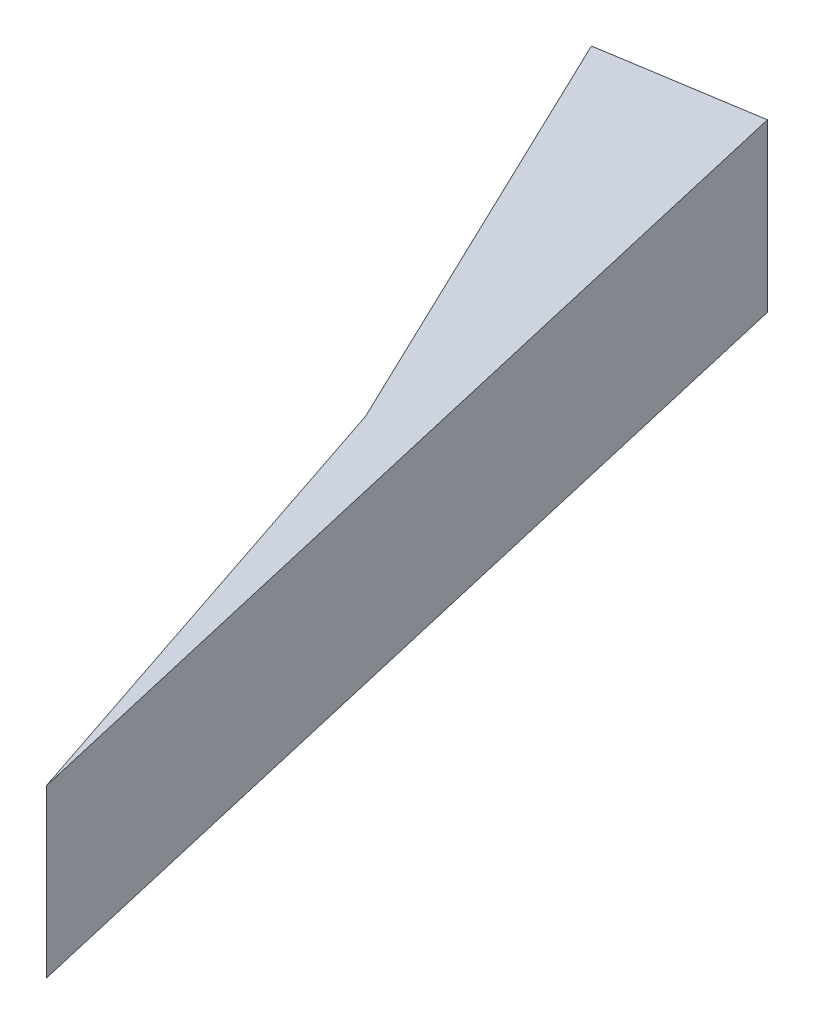
ISO-10303-21;
HEADER;
FILE_DESCRIPTION(('STEP AP214'),'2;1');
FILE_NAME('part.step','',(''),(''),'','','');
FILE_SCHEMA(('AUTOMOTIVE_DESIGN { 1 0 10303 214 1 1 1 1 }'));
ENDSEC;
DATA;
#1=APPLICATION_CONTEXT('core data for automotive mechanical design processes');
#2=APPLICATION_PROTOCOL_DEFINITION('international standard','automotive_design',2000,#1);
#3=PRODUCT_CONTEXT('',#1,'mechanical');
#4=PRODUCT('Part','Part','',(#3));
#5=PRODUCT_RELATED_PRODUCT_CATEGORY('part','',(#4));
#6=PRODUCT_DEFINITION_FORMATION('','',#4);
#7=PRODUCT_DEFINITION_CONTEXT('part definition',#1,'design');
#8=PRODUCT_DEFINITION('design','',#6,#7);
#9=PRODUCT_DEFINITION_SHAPE('','',#8);
#10=(LENGTH_UNIT() NAMED_UNIT(*) SI_UNIT(.MILLI.,.METRE.));
#11=(NAMED_UNIT(*) PLANE_ANGLE_UNIT() SI_UNIT($,.RADIAN.));
#12=(NAMED_UNIT(*) SI_UNIT($,.STERADIAN.) SOLID_ANGLE_UNIT());
#13=UNCERTAINTY_MEASURE_WITH_UNIT(LENGTH_MEASURE(1.E-05),#10,'distance_accuracy_value','');
#14=(GEOMETRIC_REPRESENTATION_CONTEXT(3) GLOBAL_UNCERTAINTY_ASSIGNED_CONTEXT((#13)) GLOBAL_UNIT_ASSIGNED_CONTEXT((#10,
#11,#12)) REPRESENTATION_CONTEXT('',''));
#15=CARTESIAN_POINT('',(0.,0.,0.));
#16=DIRECTION('',(0.,0.,1.));
#17=DIRECTION('',(1.,0.,0.));
#18=AXIS2_PLACEMENT_3D('',#15,#16,#17);
#19=CARTESIAN_POINT('',(-19.402009430635,13.,9.29638780071025));
#20=DIRECTION('',(-0.901823425784166,0.,0.432104742749846));
#21=DIRECTION('',(0.432104742749846,0.,0.901823425784166));
#22=AXIS2_PLACEMENT_3D('',#19,#20,#21);
#23=PLANE('',#22);
#24=DIRECTION('',(-0.432104742749846,0.,-0.901823425784166));
#25=VECTOR('',#24,1.);
#26=CARTESIAN_POINT('',(-19.402009430635,-13.,9.29638780071025));
#27=LINE('',#26,#25);
#28=CARTESIAN_POINT('',(-8.10196130508189,-13.,32.8801329067246));
#29=VERTEX_POINT('',#28);
#30=CARTESIAN_POINT('',(-40.5098170113203,-13.,-34.7566240270878));
#31=VERTEX_POINT('',#30);
#32=EDGE_CURVE('E98',#29,#31,#27,.T.);
#33=ORIENTED_EDGE('',*,*,#32,.F.);
#34=DIRECTION('',(0.,-1.,0.));
#35=VECTOR('',#34,1.);
#36=CARTESIAN_POINT('',(-8.10196130508189,13.,32.8801329067246));
#37=LINE('',#36,#35);
#38=CARTESIAN_POINT('',(-8.10196130508189,13.,32.8801329067246));
#39=VERTEX_POINT('',#38);
#40=EDGE_CURVE('E11',#39,#29,#37,.T.);
#41=ORIENTED_EDGE('',*,*,#40,.F.);
#42=DIRECTION('',(-0.432104742749846,0.,-0.901823425784166));
#43=VECTOR('',#42,1.);
#44=CARTESIAN_POINT('',(-19.402009430635,13.,9.29638780071025));
#45=LINE('',#44,#43);
#46=CARTESIAN_POINT('',(-40.5098170113203,13.,-34.7566240270878));
#47=VERTEX_POINT('',#46);
#48=EDGE_CURVE('E83',#39,#47,#45,.T.);
#49=ORIENTED_EDGE('',*,*,#48,.T.);
#50=DIRECTION('',(0.,-1.,0.));
#51=VECTOR('',#50,1.);
#52=CARTESIAN_POINT('',(-40.5098170113203,13.,-34.7566240270878));
#53=LINE('',#52,#51);
#54=EDGE_CURVE('E51',#47,#31,#53,.T.);
#55=ORIENTED_EDGE('',*,*,#54,.T.);
#56=EDGE_LOOP('',(#33,#41,#49,#55));
#57=FACE_BOUND('',#56,.T.);
#58=ADVANCED_FACE('F35',(#57),#23,.T.);
#59=CARTESIAN_POINT('',(-17.1759019625535,13.,5.74321318503115));
#60=DIRECTION('',(0.948386162453697,0.,-0.317117780747707));
#61=DIRECTION('',(-0.317117780747707,0.,-0.948386162453697));
#62=AXIS2_PLACEMENT_3D('',#59,#60,#61);
#63=PLANE('',#62);
#64=DIRECTION('',(0.317117780747707,0.,0.948386162453696));
#65=VECTOR('',#64,1.);
#66=CARTESIAN_POINT('',(-17.1759019625535,-13.,5.74321318503115));
#67=LINE('',#66,#65);
#68=CARTESIAN_POINT('',(16.8980386949181,-13.,107.646215103186));
#69=VERTEX_POINT('',#68);
#70=EDGE_CURVE('E89',#29,#69,#67,.T.);
#71=ORIENTED_EDGE('',*,*,#70,.T.);
#72=DIRECTION('',(0.,-1.,0.));
#73=VECTOR('',#72,1.);
#74=CARTESIAN_POINT('',(16.8980386949181,13.,107.646215103186));
#75=LINE('',#74,#73);
#76=CARTESIAN_POINT('',(16.8980386949181,13.,107.646215103186));
#77=VERTEX_POINT('',#76);
#78=EDGE_CURVE('E43',#77,#69,#75,.T.);
#79=ORIENTED_EDGE('',*,*,#78,.F.);
#80=DIRECTION('',(0.317117780747707,0.,0.948386162453696));
#81=VECTOR('',#80,1.);
#82=CARTESIAN_POINT('',(-17.1759019625535,13.,5.74321318503115));
#83=LINE('',#82,#81);
#84=EDGE_CURVE('E77',#39,#77,#83,.T.);
#85=ORIENTED_EDGE('',*,*,#84,.F.);
#86=ORIENTED_EDGE('',*,*,#40,.T.);
#87=EDGE_LOOP('',(#71,#79,#85,#86));
#88=FACE_BOUND('',#87,.T.);
#89=ADVANCED_FACE('F87',(#88),#63,.F.);
#90=CARTESIAN_POINT('',(-7.52432212531483,13.,1.73505521098185));
#91=DIRECTION('',(0.974428829757841,0.,-0.224696363425768));
#92=DIRECTION('',(-0.224696363425768,0.,-0.974428829757841));
#93=AXIS2_PLACEMENT_3D('',#90,#91,#92);
#94=PLANE('',#93);
#95=DIRECTION('',(0.224696363425768,0.,0.974428829757841));
#96=VECTOR('',#95,1.);
#97=CARTESIAN_POINT('',(-7.52432212531483,-13.,1.73505521098185));
#98=LINE('',#97,#96);
#99=CARTESIAN_POINT('',(-16.8064158189472,-13.,-38.5181093604903));
#100=VERTEX_POINT('',#99);
#101=EDGE_CURVE('E101',#100,#69,#98,.T.);
#102=ORIENTED_EDGE('',*,*,#101,.F.);
#103=DIRECTION('',(0.,-1.,0.));
#104=VECTOR('',#103,1.);
#105=CARTESIAN_POINT('',(-16.8064158189472,13.,-38.5181093604903));
#106=LINE('',#105,#104);
#107=CARTESIAN_POINT('',(-16.8064158189472,13.,-38.5181093604903));
#108=VERTEX_POINT('',#107);
#109=EDGE_CURVE('E64',#108,#100,#106,.T.);
#110=ORIENTED_EDGE('',*,*,#109,.F.);
#111=DIRECTION('',(0.224696363425768,0.,0.974428829757841));
#112=VECTOR('',#111,1.);
#113=CARTESIAN_POINT('',(-7.52432212531483,13.,1.73505521098185));
#114=LINE('',#113,#112);
#115=EDGE_CURVE('E82',#108,#77,#114,.T.);
#116=ORIENTED_EDGE('',*,*,#115,.T.);
#117=ORIENTED_EDGE('',*,*,#78,.T.);
#118=EDGE_LOOP('',(#102,#110,#116,#117));
#119=FACE_BOUND('',#118,.T.);
#120=ADVANCED_FACE('F92',(#119),#94,.T.);
#121=CARTESIAN_POINT('',(-6.37511218434236,13.,-40.1734496769028));
#122=DIRECTION('',(-0.156728555558438,0.,-0.987641716348882));
#123=DIRECTION('',(-0.987641716348882,0.,0.156728555558438));
#124=AXIS2_PLACEMENT_3D('',#121,#122,#123);
#125=PLANE('',#124);
#126=DIRECTION('',(0.987641716348882,0.,-0.156728555558438));
#127=VECTOR('',#126,1.);
#128=CARTESIAN_POINT('',(-6.37511218434236,-13.,-40.1734496769028));
#129=LINE('',#128,#127);
#130=EDGE_CURVE('E103',#31,#100,#129,.T.);
#131=ORIENTED_EDGE('',*,*,#130,.F.);
#132=ORIENTED_EDGE('',*,*,#54,.F.);
#133=DIRECTION('',(0.987641716348882,0.,-0.156728555558438));
#134=VECTOR('',#133,1.);
#135=CARTESIAN_POINT('',(-6.37511218434236,13.,-40.1734496769028));
#136=LINE('',#135,#134);
#137=EDGE_CURVE('E93',#47,#108,#136,.T.);
#138=ORIENTED_EDGE('',*,*,#137,.T.);
#139=ORIENTED_EDGE('',*,*,#109,.T.);
#140=EDGE_LOOP('',(#131,#132,#138,#139));
#141=FACE_BOUND('',#140,.T.);
#142=ADVANCED_FACE('F108',(#141),#125,.T.);
#143=CARTESIAN_POINT('',(0.,13.,0.));
#144=DIRECTION('',(0.,1.,0.));
#145=DIRECTION('',(0.,0.,1.));
#146=AXIS2_PLACEMENT_3D('',#143,#144,#145);
#147=PLANE('',#146);
#148=ORIENTED_EDGE('',*,*,#48,.F.);
#149=ORIENTED_EDGE('',*,*,#84,.T.);
#150=ORIENTED_EDGE('',*,*,#115,.F.);
#151=ORIENTED_EDGE('',*,*,#137,.F.);
#152=EDGE_LOOP('',(#148,#149,#150,#151));
#153=FACE_BOUND('',#152,.T.);
#154=ADVANCED_FACE('F79',(#153),#147,.T.);
#155=CARTESIAN_POINT('',(0.,-13.,0.));
#156=DIRECTION('',(0.,1.,0.));
#157=DIRECTION('',(0.,0.,1.));
#158=AXIS2_PLACEMENT_3D('',#155,#156,#157);
#159=PLANE('',#158);
#160=ORIENTED_EDGE('',*,*,#32,.T.);
#161=ORIENTED_EDGE('',*,*,#130,.T.);
#162=ORIENTED_EDGE('',*,*,#101,.T.);
#163=ORIENTED_EDGE('',*,*,#70,.F.);
#164=EDGE_LOOP('',(#160,#161,#162,#163));
#165=FACE_BOUND('',#164,.T.);
#166=ADVANCED_FACE('F115',(#165),#159,.F.);
#167=CLOSED_SHELL('',(#58,#89,#120,#142,#154,#166));
#168=MANIFOLD_SOLID_BREP('B2',#167);
#169=ADVANCED_BREP_SHAPE_REPRESENTATION('',(#18,#168),#14);
#170=SHAPE_DEFINITION_REPRESENTATION(#9,#169);
ENDSEC;
END-ISO-10303-21;
